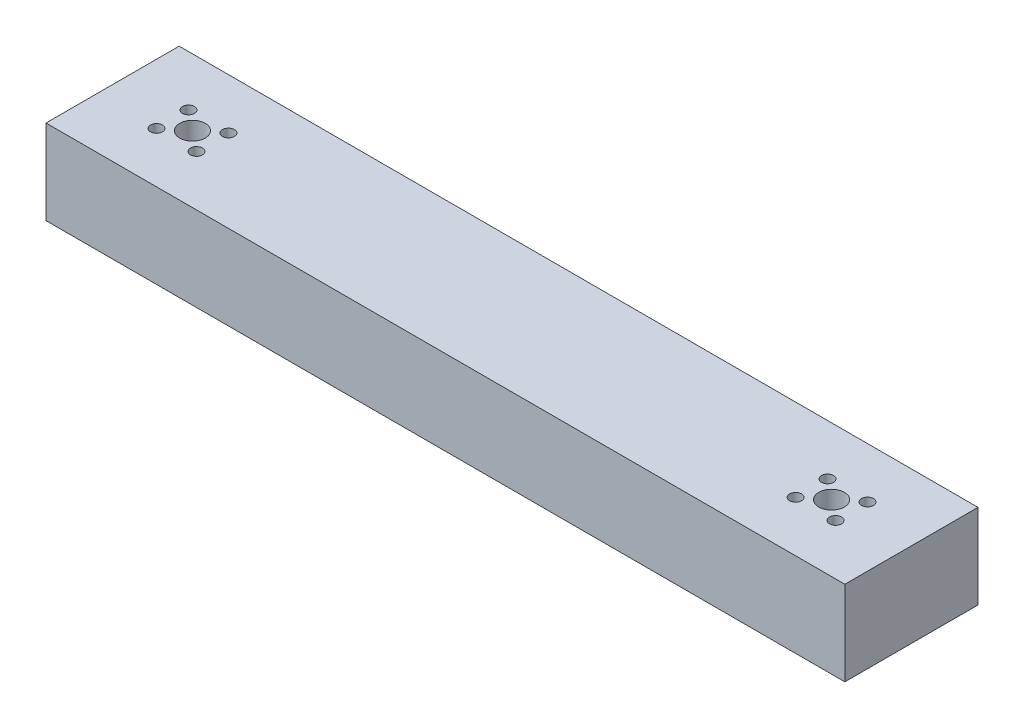
ISO-10303-21;
HEADER;
FILE_DESCRIPTION(('STEP AP214'),'2;1');
FILE_NAME('part.step','',(''),(''),'','','');
FILE_SCHEMA(('AUTOMOTIVE_DESIGN { 1 0 10303 214 1 1 1 1 }'));
ENDSEC;
DATA;
#1=APPLICATION_CONTEXT('core data for automotive mechanical design processes');
#2=APPLICATION_PROTOCOL_DEFINITION('international standard','automotive_design',2000,#1);
#3=PRODUCT_CONTEXT('',#1,'mechanical');
#4=PRODUCT('Part','Part','',(#3));
#5=PRODUCT_RELATED_PRODUCT_CATEGORY('part','',(#4));
#6=PRODUCT_DEFINITION_FORMATION('','',#4);
#7=PRODUCT_DEFINITION_CONTEXT('part definition',#1,'design');
#8=PRODUCT_DEFINITION('design','',#6,#7);
#9=PRODUCT_DEFINITION_SHAPE('','',#8);
#10=(LENGTH_UNIT() NAMED_UNIT(*) SI_UNIT(.MILLI.,.METRE.));
#11=(NAMED_UNIT(*) PLANE_ANGLE_UNIT() SI_UNIT($,.RADIAN.));
#12=(NAMED_UNIT(*) SI_UNIT($,.STERADIAN.) SOLID_ANGLE_UNIT());
#13=UNCERTAINTY_MEASURE_WITH_UNIT(LENGTH_MEASURE(1.E-05),#10,'distance_accuracy_value','');
#14=(GEOMETRIC_REPRESENTATION_CONTEXT(3) GLOBAL_UNCERTAINTY_ASSIGNED_CONTEXT((#13)) GLOBAL_UNIT_ASSIGNED_CONTEXT((#10,
#11,#12)) REPRESENTATION_CONTEXT('',''));
#15=CARTESIAN_POINT('',(0.,0.,0.));
#16=DIRECTION('',(0.,0.,1.));
#17=DIRECTION('',(1.,0.,0.));
#18=AXIS2_PLACEMENT_3D('',#15,#16,#17);
#19=CARTESIAN_POINT('',(0.,31.75,0.));
#20=DIRECTION('',(1.,0.,0.));
#21=DIRECTION('',(0.,0.,-1.));
#22=AXIS2_PLACEMENT_3D('',#19,#20,#21);
#23=PLANE('',#22);
#24=DIRECTION('',(0.,0.,1.));
#25=VECTOR('',#24,1.);
#26=CARTESIAN_POINT('',(0.,0.,0.));
#27=LINE('',#26,#25);
#28=CARTESIAN_POINT('',(0.,0.,-50.));
#29=VERTEX_POINT('',#28);
#30=CARTESIAN_POINT('',(0.,0.,0.));
#31=VERTEX_POINT('',#30);
#32=EDGE_CURVE('E102',#29,#31,#27,.T.);
#33=ORIENTED_EDGE('',*,*,#32,.T.);
#34=DIRECTION('',(0.,-1.,0.));
#35=VECTOR('',#34,1.);
#36=CARTESIAN_POINT('',(0.,31.75,0.));
#37=LINE('',#36,#35);
#38=CARTESIAN_POINT('',(0.,31.75,0.));
#39=VERTEX_POINT('',#38);
#40=EDGE_CURVE('E11',#39,#31,#37,.T.);
#41=ORIENTED_EDGE('',*,*,#40,.F.);
#42=DIRECTION('',(0.,0.,1.));
#43=VECTOR('',#42,1.);
#44=CARTESIAN_POINT('',(0.,31.75,0.));
#45=LINE('',#44,#43);
#46=CARTESIAN_POINT('',(0.,31.75,-50.));
#47=VERTEX_POINT('',#46);
#48=EDGE_CURVE('E90',#47,#39,#45,.T.);
#49=ORIENTED_EDGE('',*,*,#48,.F.);
#50=DIRECTION('',(0.,-1.,0.));
#51=VECTOR('',#50,1.);
#52=CARTESIAN_POINT('',(0.,31.75,-50.));
#53=LINE('',#52,#51);
#54=EDGE_CURVE('E98',#47,#29,#53,.T.);
#55=ORIENTED_EDGE('',*,*,#54,.T.);
#56=EDGE_LOOP('',(#33,#41,#49,#55));
#57=FACE_BOUND('',#56,.T.);
#58=ADVANCED_FACE('F39',(#57),#23,.F.);
#59=CARTESIAN_POINT('',(0.,31.75,0.));
#60=DIRECTION('',(0.,0.,-1.));
#61=DIRECTION('',(-1.,0.,0.));
#62=AXIS2_PLACEMENT_3D('',#59,#60,#61);
#63=PLANE('',#62);
#64=DIRECTION('',(1.,0.,0.));
#65=VECTOR('',#64,1.);
#66=CARTESIAN_POINT('',(0.,0.,0.));
#67=LINE('',#66,#65);
#68=CARTESIAN_POINT('',(300.,0.,0.));
#69=VERTEX_POINT('',#68);
#70=EDGE_CURVE('E94',#31,#69,#67,.T.);
#71=ORIENTED_EDGE('',*,*,#70,.T.);
#72=DIRECTION('',(0.,-1.,0.));
#73=VECTOR('',#72,1.);
#74=CARTESIAN_POINT('',(300.,31.75,0.));
#75=LINE('',#74,#73);
#76=CARTESIAN_POINT('',(300.,31.75,0.));
#77=VERTEX_POINT('',#76);
#78=EDGE_CURVE('E47',#77,#69,#75,.T.);
#79=ORIENTED_EDGE('',*,*,#78,.F.);
#80=DIRECTION('',(1.,0.,0.));
#81=VECTOR('',#80,1.);
#82=CARTESIAN_POINT('',(0.,31.75,0.));
#83=LINE('',#82,#81);
#84=EDGE_CURVE('E85',#39,#77,#83,.T.);
#85=ORIENTED_EDGE('',*,*,#84,.F.);
#86=ORIENTED_EDGE('',*,*,#40,.T.);
#87=EDGE_LOOP('',(#71,#79,#85,#86));
#88=FACE_BOUND('',#87,.T.);
#89=ADVANCED_FACE('F93',(#88),#63,.F.);
#90=CARTESIAN_POINT('',(300.,31.75,0.));
#91=DIRECTION('',(-1.,0.,0.));
#92=DIRECTION('',(0.,0.,1.));
#93=AXIS2_PLACEMENT_3D('',#90,#91,#92);
#94=PLANE('',#93);
#95=DIRECTION('',(0.,0.,-1.));
#96=VECTOR('',#95,1.);
#97=CARTESIAN_POINT('',(300.,0.,0.));
#98=LINE('',#97,#96);
#99=CARTESIAN_POINT('',(300.,0.,-50.));
#100=VERTEX_POINT('',#99);
#101=EDGE_CURVE('E72',#69,#100,#98,.T.);
#102=ORIENTED_EDGE('',*,*,#101,.T.);
#103=DIRECTION('',(0.,-1.,0.));
#104=VECTOR('',#103,1.);
#105=CARTESIAN_POINT('',(300.,31.75,-50.));
#106=LINE('',#105,#104);
#107=CARTESIAN_POINT('',(300.,31.75,-50.));
#108=VERTEX_POINT('',#107);
#109=EDGE_CURVE('E95',#108,#100,#106,.T.);
#110=ORIENTED_EDGE('',*,*,#109,.F.);
#111=DIRECTION('',(0.,0.,-1.));
#112=VECTOR('',#111,1.);
#113=CARTESIAN_POINT('',(300.,31.75,0.));
#114=LINE('',#113,#112);
#115=EDGE_CURVE('E88',#77,#108,#114,.T.);
#116=ORIENTED_EDGE('',*,*,#115,.F.);
#117=ORIENTED_EDGE('',*,*,#78,.T.);
#118=EDGE_LOOP('',(#102,#110,#116,#117));
#119=FACE_BOUND('',#118,.T.);
#120=ADVANCED_FACE('F96',(#119),#94,.F.);
#121=CARTESIAN_POINT('',(0.,31.75,-50.));
#122=DIRECTION('',(0.,0.,1.));
#123=DIRECTION('',(1.,0.,0.));
#124=AXIS2_PLACEMENT_3D('',#121,#122,#123);
#125=PLANE('',#124);
#126=DIRECTION('',(-1.,0.,0.));
#127=VECTOR('',#126,1.);
#128=CARTESIAN_POINT('',(0.,0.,-50.));
#129=LINE('',#128,#127);
#130=EDGE_CURVE('E78',#100,#29,#129,.T.);
#131=ORIENTED_EDGE('',*,*,#130,.T.);
#132=ORIENTED_EDGE('',*,*,#54,.F.);
#133=DIRECTION('',(-1.,0.,0.));
#134=VECTOR('',#133,1.);
#135=CARTESIAN_POINT('',(0.,31.75,-50.));
#136=LINE('',#135,#134);
#137=EDGE_CURVE('E55',#108,#47,#136,.T.);
#138=ORIENTED_EDGE('',*,*,#137,.F.);
#139=ORIENTED_EDGE('',*,*,#109,.T.);
#140=EDGE_LOOP('',(#131,#132,#138,#139));
#141=FACE_BOUND('',#140,.T.);
#142=ADVANCED_FACE('F110',(#141),#125,.F.);
#143=CARTESIAN_POINT('',(0.,31.75,0.));
#144=DIRECTION('',(0.,-1.,0.));
#145=DIRECTION('',(0.,0.,-1.));
#146=AXIS2_PLACEMENT_3D('',#143,#144,#145);
#147=PLANE('',#146);
#148=CARTESIAN_POINT('',(22.5,31.75,-31.));
#149=DIRECTION('',(0.,1.,0.));
#150=DIRECTION('',(0.,0.,1.));
#151=AXIS2_PLACEMENT_3D('',#148,#149,#150);
#152=CIRCLE('',#151,2.25);
#153=CARTESIAN_POINT('',(22.5,31.75,-28.75));
#154=VERTEX_POINT('',#153);
#155=EDGE_CURVE('E165',#154,#154,#152,.T.);
#156=ORIENTED_EDGE('',*,*,#155,.F.);
#157=EDGE_LOOP('',(#156));
#158=FACE_BOUND('',#157,.T.);
#159=CARTESIAN_POINT('',(262.5,31.75,-19.));
#160=DIRECTION('',(0.,1.,0.));
#161=DIRECTION('',(0.,0.,1.));
#162=AXIS2_PLACEMENT_3D('',#159,#160,#161);
#163=CIRCLE('',#162,2.24999999999995);
#164=CARTESIAN_POINT('',(262.5,31.75,-16.75));
#165=VERTEX_POINT('',#164);
#166=EDGE_CURVE('E166',#165,#165,#163,.T.);
#167=ORIENTED_EDGE('',*,*,#166,.F.);
#168=EDGE_LOOP('',(#167));
#169=FACE_BOUND('',#168,.T.);
#170=CARTESIAN_POINT('',(262.5,31.75,-31.));
#171=DIRECTION('',(0.,1.,0.));
#172=DIRECTION('',(0.,0.,1.));
#173=AXIS2_PLACEMENT_3D('',#170,#171,#172);
#174=CIRCLE('',#173,2.24999999999995);
#175=CARTESIAN_POINT('',(262.5,31.75,-28.75));
#176=VERTEX_POINT('',#175);
#177=EDGE_CURVE('E140',#176,#176,#174,.T.);
#178=ORIENTED_EDGE('',*,*,#177,.F.);
#179=EDGE_LOOP('',(#178));
#180=FACE_BOUND('',#179,.T.);
#181=CARTESIAN_POINT('',(277.5,31.75,-31.));
#182=DIRECTION('',(0.,1.,0.));
#183=DIRECTION('',(0.,0.,1.));
#184=AXIS2_PLACEMENT_3D('',#181,#182,#183);
#185=CIRCLE('',#184,2.24999999999995);
#186=CARTESIAN_POINT('',(277.5,31.75,-28.75));
#187=VERTEX_POINT('',#186);
#188=EDGE_CURVE('E147',#187,#187,#185,.T.);
#189=ORIENTED_EDGE('',*,*,#188,.F.);
#190=EDGE_LOOP('',(#189));
#191=FACE_BOUND('',#190,.T.);
#192=CARTESIAN_POINT('',(37.5,31.75,-19.));
#193=DIRECTION('',(0.,1.,0.));
#194=DIRECTION('',(0.,0.,1.));
#195=AXIS2_PLACEMENT_3D('',#192,#193,#194);
#196=CIRCLE('',#195,2.25);
#197=CARTESIAN_POINT('',(37.5,31.75,-16.75));
#198=VERTEX_POINT('',#197);
#199=EDGE_CURVE('E153',#198,#198,#196,.T.);
#200=ORIENTED_EDGE('',*,*,#199,.F.);
#201=EDGE_LOOP('',(#200));
#202=FACE_BOUND('',#201,.T.);
#203=CARTESIAN_POINT('',(37.5,31.75,-31.));
#204=DIRECTION('',(0.,1.,0.));
#205=DIRECTION('',(0.,0.,1.));
#206=AXIS2_PLACEMENT_3D('',#203,#204,#205);
#207=CIRCLE('',#206,2.25);
#208=CARTESIAN_POINT('',(37.5,31.75,-28.75));
#209=VERTEX_POINT('',#208);
#210=EDGE_CURVE('E159',#209,#209,#207,.T.);
#211=ORIENTED_EDGE('',*,*,#210,.F.);
#212=EDGE_LOOP('',(#211));
#213=FACE_BOUND('',#212,.T.);
#214=CARTESIAN_POINT('',(22.5,31.75,-19.));
#215=DIRECTION('',(0.,1.,0.));
#216=DIRECTION('',(0.,0.,1.));
#217=AXIS2_PLACEMENT_3D('',#214,#215,#216);
#218=CIRCLE('',#217,2.25);
#219=CARTESIAN_POINT('',(22.5,31.75,-16.75));
#220=VERTEX_POINT('',#219);
#221=EDGE_CURVE('E129',#220,#220,#218,.T.);
#222=ORIENTED_EDGE('',*,*,#221,.F.);
#223=EDGE_LOOP('',(#222));
#224=FACE_BOUND('',#223,.T.);
#225=CARTESIAN_POINT('',(270.,31.75,-25.));
#226=DIRECTION('',(0.,1.,0.));
#227=DIRECTION('',(0.,0.,1.));
#228=AXIS2_PLACEMENT_3D('',#225,#226,#227);
#229=CIRCLE('',#228,4.8);
#230=CARTESIAN_POINT('',(270.,31.75,-20.2));
#231=VERTEX_POINT('',#230);
#232=EDGE_CURVE('E130',#231,#231,#229,.T.);
#233=ORIENTED_EDGE('',*,*,#232,.F.);
#234=EDGE_LOOP('',(#233));
#235=FACE_BOUND('',#234,.T.);
#236=CARTESIAN_POINT('',(277.5,31.75,-19.));
#237=DIRECTION('',(0.,1.,0.));
#238=DIRECTION('',(0.,0.,1.));
#239=AXIS2_PLACEMENT_3D('',#236,#237,#238);
#240=CIRCLE('',#239,2.24999999999995);
#241=CARTESIAN_POINT('',(277.5,31.75,-16.75));
#242=VERTEX_POINT('',#241);
#243=EDGE_CURVE('E116',#242,#242,#240,.T.);
#244=ORIENTED_EDGE('',*,*,#243,.F.);
#245=EDGE_LOOP('',(#244));
#246=FACE_BOUND('',#245,.T.);
#247=CARTESIAN_POINT('',(30.,31.75,-25.));
#248=DIRECTION('',(0.,1.,0.));
#249=DIRECTION('',(0.,0.,1.));
#250=AXIS2_PLACEMENT_3D('',#247,#248,#249);
#251=CIRCLE('',#250,4.8);
#252=CARTESIAN_POINT('',(30.,31.75,-20.2));
#253=VERTEX_POINT('',#252);
#254=EDGE_CURVE('E123',#253,#253,#251,.T.);
#255=ORIENTED_EDGE('',*,*,#254,.F.);
#256=EDGE_LOOP('',(#255));
#257=FACE_BOUND('',#256,.T.);
#258=ORIENTED_EDGE('',*,*,#48,.T.);
#259=ORIENTED_EDGE('',*,*,#84,.T.);
#260=ORIENTED_EDGE('',*,*,#115,.T.);
#261=ORIENTED_EDGE('',*,*,#137,.T.);
#262=EDGE_LOOP('',(#258,#259,#260,#261));
#263=FACE_BOUND('',#262,.T.);
#264=ADVANCED_FACE('F86',(#158,#169,#180,#191,#202,#213,#224,#235,#246,#257,#263),#147,.F.);
#265=CARTESIAN_POINT('',(0.,0.,0.));
#266=DIRECTION('',(0.,-1.,0.));
#267=DIRECTION('',(0.,0.,-1.));
#268=AXIS2_PLACEMENT_3D('',#265,#266,#267);
#269=PLANE('',#268);
#270=CARTESIAN_POINT('',(22.5,0.,-31.));
#271=DIRECTION('',(0.,1.,0.));
#272=DIRECTION('',(0.,0.,1.));
#273=AXIS2_PLACEMENT_3D('',#270,#271,#272);
#274=CIRCLE('',#273,2.25);
#275=CARTESIAN_POINT('',(22.5,0.,-28.75));
#276=VERTEX_POINT('',#275);
#277=EDGE_CURVE('E133',#276,#276,#274,.T.);
#278=ORIENTED_EDGE('',*,*,#277,.T.);
#279=EDGE_LOOP('',(#278));
#280=FACE_BOUND('',#279,.T.);
#281=CARTESIAN_POINT('',(262.5,0.,-19.));
#282=DIRECTION('',(0.,1.,0.));
#283=DIRECTION('',(0.,0.,1.));
#284=AXIS2_PLACEMENT_3D('',#281,#282,#283);
#285=CIRCLE('',#284,2.24999999999995);
#286=CARTESIAN_POINT('',(262.5,0.,-16.75));
#287=VERTEX_POINT('',#286);
#288=EDGE_CURVE('E144',#287,#287,#285,.T.);
#289=ORIENTED_EDGE('',*,*,#288,.T.);
#290=EDGE_LOOP('',(#289));
#291=FACE_BOUND('',#290,.T.);
#292=CARTESIAN_POINT('',(262.5,0.,-31.));
#293=DIRECTION('',(0.,1.,0.));
#294=DIRECTION('',(0.,0.,1.));
#295=AXIS2_PLACEMENT_3D('',#292,#293,#294);
#296=CIRCLE('',#295,2.24999999999995);
#297=CARTESIAN_POINT('',(262.5,0.,-28.75));
#298=VERTEX_POINT('',#297);
#299=EDGE_CURVE('E143',#298,#298,#296,.T.);
#300=ORIENTED_EDGE('',*,*,#299,.T.);
#301=EDGE_LOOP('',(#300));
#302=FACE_BOUND('',#301,.T.);
#303=CARTESIAN_POINT('',(277.5,0.,-31.));
#304=DIRECTION('',(0.,1.,0.));
#305=DIRECTION('',(0.,0.,1.));
#306=AXIS2_PLACEMENT_3D('',#303,#304,#305);
#307=CIRCLE('',#306,2.24999999999995);
#308=CARTESIAN_POINT('',(277.5,0.,-28.75));
#309=VERTEX_POINT('',#308);
#310=EDGE_CURVE('E150',#309,#309,#307,.T.);
#311=ORIENTED_EDGE('',*,*,#310,.T.);
#312=EDGE_LOOP('',(#311));
#313=FACE_BOUND('',#312,.T.);
#314=CARTESIAN_POINT('',(37.5,0.,-19.));
#315=DIRECTION('',(0.,1.,0.));
#316=DIRECTION('',(0.,0.,1.));
#317=AXIS2_PLACEMENT_3D('',#314,#315,#316);
#318=CIRCLE('',#317,2.25);
#319=CARTESIAN_POINT('',(37.5,0.,-16.75));
#320=VERTEX_POINT('',#319);
#321=EDGE_CURVE('E156',#320,#320,#318,.T.);
#322=ORIENTED_EDGE('',*,*,#321,.T.);
#323=EDGE_LOOP('',(#322));
#324=FACE_BOUND('',#323,.T.);
#325=CARTESIAN_POINT('',(37.5,0.,-31.));
#326=DIRECTION('',(0.,1.,0.));
#327=DIRECTION('',(0.,0.,1.));
#328=AXIS2_PLACEMENT_3D('',#325,#326,#327);
#329=CIRCLE('',#328,2.25);
#330=CARTESIAN_POINT('',(37.5,0.,-28.75));
#331=VERTEX_POINT('',#330);
#332=EDGE_CURVE('E162',#331,#331,#329,.T.);
#333=ORIENTED_EDGE('',*,*,#332,.T.);
#334=EDGE_LOOP('',(#333));
#335=FACE_BOUND('',#334,.T.);
#336=CARTESIAN_POINT('',(22.5,0.,-19.));
#337=DIRECTION('',(0.,1.,0.));
#338=DIRECTION('',(0.,0.,1.));
#339=AXIS2_PLACEMENT_3D('',#336,#337,#338);
#340=CIRCLE('',#339,2.25);
#341=CARTESIAN_POINT('',(22.5,0.,-16.75));
#342=VERTEX_POINT('',#341);
#343=EDGE_CURVE('E105',#342,#342,#340,.T.);
#344=ORIENTED_EDGE('',*,*,#343,.T.);
#345=EDGE_LOOP('',(#344));
#346=FACE_BOUND('',#345,.T.);
#347=CARTESIAN_POINT('',(270.,0.,-25.));
#348=DIRECTION('',(0.,1.,0.));
#349=DIRECTION('',(0.,0.,1.));
#350=AXIS2_PLACEMENT_3D('',#347,#348,#349);
#351=CIRCLE('',#350,4.8);
#352=CARTESIAN_POINT('',(270.,0.,-20.2));
#353=VERTEX_POINT('',#352);
#354=EDGE_CURVE('E120',#353,#353,#351,.T.);
#355=ORIENTED_EDGE('',*,*,#354,.T.);
#356=EDGE_LOOP('',(#355));
#357=FACE_BOUND('',#356,.T.);
#358=CARTESIAN_POINT('',(277.5,0.,-19.));
#359=DIRECTION('',(0.,1.,0.));
#360=DIRECTION('',(0.,0.,1.));
#361=AXIS2_PLACEMENT_3D('',#358,#359,#360);
#362=CIRCLE('',#361,2.24999999999995);
#363=CARTESIAN_POINT('',(277.5,0.,-16.75));
#364=VERTEX_POINT('',#363);
#365=EDGE_CURVE('E119',#364,#364,#362,.T.);
#366=ORIENTED_EDGE('',*,*,#365,.T.);
#367=EDGE_LOOP('',(#366));
#368=FACE_BOUND('',#367,.T.);
#369=CARTESIAN_POINT('',(30.,0.,-25.));
#370=DIRECTION('',(0.,1.,0.));
#371=DIRECTION('',(0.,0.,1.));
#372=AXIS2_PLACEMENT_3D('',#369,#370,#371);
#373=CIRCLE('',#372,4.8);
#374=CARTESIAN_POINT('',(30.,0.,-20.2));
#375=VERTEX_POINT('',#374);
#376=EDGE_CURVE('E126',#375,#375,#373,.T.);
#377=ORIENTED_EDGE('',*,*,#376,.T.);
#378=EDGE_LOOP('',(#377));
#379=FACE_BOUND('',#378,.T.);
#380=ORIENTED_EDGE('',*,*,#32,.F.);
#381=ORIENTED_EDGE('',*,*,#130,.F.);
#382=ORIENTED_EDGE('',*,*,#101,.F.);
#383=ORIENTED_EDGE('',*,*,#70,.F.);
#384=EDGE_LOOP('',(#380,#381,#382,#383));
#385=FACE_BOUND('',#384,.T.);
#386=ADVANCED_FACE('F113',(#280,#291,#302,#313,#324,#335,#346,#357,#368,#379,#385),#269,.T.);
#387=CARTESIAN_POINT('',(30.,0.,-25.));
#388=DIRECTION('',(0.,1.,0.));
#389=DIRECTION('',(0.,0.,1.));
#390=AXIS2_PLACEMENT_3D('',#387,#388,#389);
#391=CYLINDRICAL_SURFACE('',#390,4.8);
#392=ORIENTED_EDGE('',*,*,#376,.F.);
#393=EDGE_LOOP('',(#392));
#394=FACE_BOUND('',#393,.T.);
#395=ORIENTED_EDGE('',*,*,#254,.T.);
#396=EDGE_LOOP('',(#395));
#397=FACE_BOUND('',#396,.T.);
#398=ADVANCED_FACE('F206',(#394,#397),#391,.F.);
#399=CARTESIAN_POINT('',(277.5,0.,-19.));
#400=DIRECTION('',(0.,1.,0.));
#401=DIRECTION('',(0.,0.,1.));
#402=AXIS2_PLACEMENT_3D('',#399,#400,#401);
#403=CYLINDRICAL_SURFACE('',#402,2.24999999999995);
#404=ORIENTED_EDGE('',*,*,#365,.F.);
#405=EDGE_LOOP('',(#404));
#406=FACE_BOUND('',#405,.T.);
#407=ORIENTED_EDGE('',*,*,#243,.T.);
#408=EDGE_LOOP('',(#407));
#409=FACE_BOUND('',#408,.T.);
#410=ADVANCED_FACE('F208',(#406,#409),#403,.F.);
#411=CARTESIAN_POINT('',(270.,0.,-25.));
#412=DIRECTION('',(0.,1.,0.));
#413=DIRECTION('',(0.,0.,1.));
#414=AXIS2_PLACEMENT_3D('',#411,#412,#413);
#415=CYLINDRICAL_SURFACE('',#414,4.8);
#416=ORIENTED_EDGE('',*,*,#354,.F.);
#417=EDGE_LOOP('',(#416));
#418=FACE_BOUND('',#417,.T.);
#419=ORIENTED_EDGE('',*,*,#232,.T.);
#420=EDGE_LOOP('',(#419));
#421=FACE_BOUND('',#420,.T.);
#422=ADVANCED_FACE('F215',(#418,#421),#415,.F.);
#423=CARTESIAN_POINT('',(22.5,0.,-19.));
#424=DIRECTION('',(0.,1.,0.));
#425=DIRECTION('',(0.,0.,1.));
#426=AXIS2_PLACEMENT_3D('',#423,#424,#425);
#427=CYLINDRICAL_SURFACE('',#426,2.25);
#428=ORIENTED_EDGE('',*,*,#343,.F.);
#429=EDGE_LOOP('',(#428));
#430=FACE_BOUND('',#429,.T.);
#431=ORIENTED_EDGE('',*,*,#221,.T.);
#432=EDGE_LOOP('',(#431));
#433=FACE_BOUND('',#432,.T.);
#434=ADVANCED_FACE('F275',(#430,#433),#427,.F.);
#435=CARTESIAN_POINT('',(37.5,0.,-31.));
#436=DIRECTION('',(0.,1.,0.));
#437=DIRECTION('',(0.,0.,1.));
#438=AXIS2_PLACEMENT_3D('',#435,#436,#437);
#439=CYLINDRICAL_SURFACE('',#438,2.25);
#440=ORIENTED_EDGE('',*,*,#332,.F.);
#441=EDGE_LOOP('',(#440));
#442=FACE_BOUND('',#441,.T.);
#443=ORIENTED_EDGE('',*,*,#210,.T.);
#444=EDGE_LOOP('',(#443));
#445=FACE_BOUND('',#444,.T.);
#446=ADVANCED_FACE('F283',(#442,#445),#439,.F.);
#447=CARTESIAN_POINT('',(37.5,0.,-19.));
#448=DIRECTION('',(0.,1.,0.));
#449=DIRECTION('',(0.,0.,1.));
#450=AXIS2_PLACEMENT_3D('',#447,#448,#449);
#451=CYLINDRICAL_SURFACE('',#450,2.25);
#452=ORIENTED_EDGE('',*,*,#321,.F.);
#453=EDGE_LOOP('',(#452));
#454=FACE_BOUND('',#453,.T.);
#455=ORIENTED_EDGE('',*,*,#199,.T.);
#456=EDGE_LOOP('',(#455));
#457=FACE_BOUND('',#456,.T.);
#458=ADVANCED_FACE('F292',(#454,#457),#451,.F.);
#459=CARTESIAN_POINT('',(277.5,0.,-31.));
#460=DIRECTION('',(0.,1.,0.));
#461=DIRECTION('',(0.,0.,1.));
#462=AXIS2_PLACEMENT_3D('',#459,#460,#461);
#463=CYLINDRICAL_SURFACE('',#462,2.24999999999995);
#464=ORIENTED_EDGE('',*,*,#310,.F.);
#465=EDGE_LOOP('',(#464));
#466=FACE_BOUND('',#465,.T.);
#467=ORIENTED_EDGE('',*,*,#188,.T.);
#468=EDGE_LOOP('',(#467));
#469=FACE_BOUND('',#468,.T.);
#470=ADVANCED_FACE('F301',(#466,#469),#463,.F.);
#471=CARTESIAN_POINT('',(262.5,0.,-31.));
#472=DIRECTION('',(0.,1.,0.));
#473=DIRECTION('',(0.,0.,1.));
#474=AXIS2_PLACEMENT_3D('',#471,#472,#473);
#475=CYLINDRICAL_SURFACE('',#474,2.24999999999995);
#476=ORIENTED_EDGE('',*,*,#299,.F.);
#477=EDGE_LOOP('',(#476));
#478=FACE_BOUND('',#477,.T.);
#479=ORIENTED_EDGE('',*,*,#177,.T.);
#480=EDGE_LOOP('',(#479));
#481=FACE_BOUND('',#480,.T.);
#482=ADVANCED_FACE('F310',(#478,#481),#475,.F.);
#483=CARTESIAN_POINT('',(262.5,0.,-19.));
#484=DIRECTION('',(0.,1.,0.));
#485=DIRECTION('',(0.,0.,1.));
#486=AXIS2_PLACEMENT_3D('',#483,#484,#485);
#487=CYLINDRICAL_SURFACE('',#486,2.24999999999995);
#488=ORIENTED_EDGE('',*,*,#288,.F.);
#489=EDGE_LOOP('',(#488));
#490=FACE_BOUND('',#489,.T.);
#491=ORIENTED_EDGE('',*,*,#166,.T.);
#492=EDGE_LOOP('',(#491));
#493=FACE_BOUND('',#492,.T.);
#494=ADVANCED_FACE('F181',(#490,#493),#487,.F.);
#495=CARTESIAN_POINT('',(22.5,0.,-31.));
#496=DIRECTION('',(0.,1.,0.));
#497=DIRECTION('',(0.,0.,1.));
#498=AXIS2_PLACEMENT_3D('',#495,#496,#497);
#499=CYLINDRICAL_SURFACE('',#498,2.25);
#500=ORIENTED_EDGE('',*,*,#277,.F.);
#501=EDGE_LOOP('',(#500));
#502=FACE_BOUND('',#501,.T.);
#503=ORIENTED_EDGE('',*,*,#155,.T.);
#504=EDGE_LOOP('',(#503));
#505=FACE_BOUND('',#504,.T.);
#506=ADVANCED_FACE('F178',(#502,#505),#499,.F.);
#507=CLOSED_SHELL('',(#58,#89,#120,#142,#264,#386,#398,#410,#422,#434,#446,#458,#470,#482,#494,#506));
#508=MANIFOLD_SOLID_BREP('B2',#507);
#509=ADVANCED_BREP_SHAPE_REPRESENTATION('',(#18,#508),#14);
#510=SHAPE_DEFINITION_REPRESENTATION(#9,#509);
ENDSEC;
END-ISO-10303-21;
